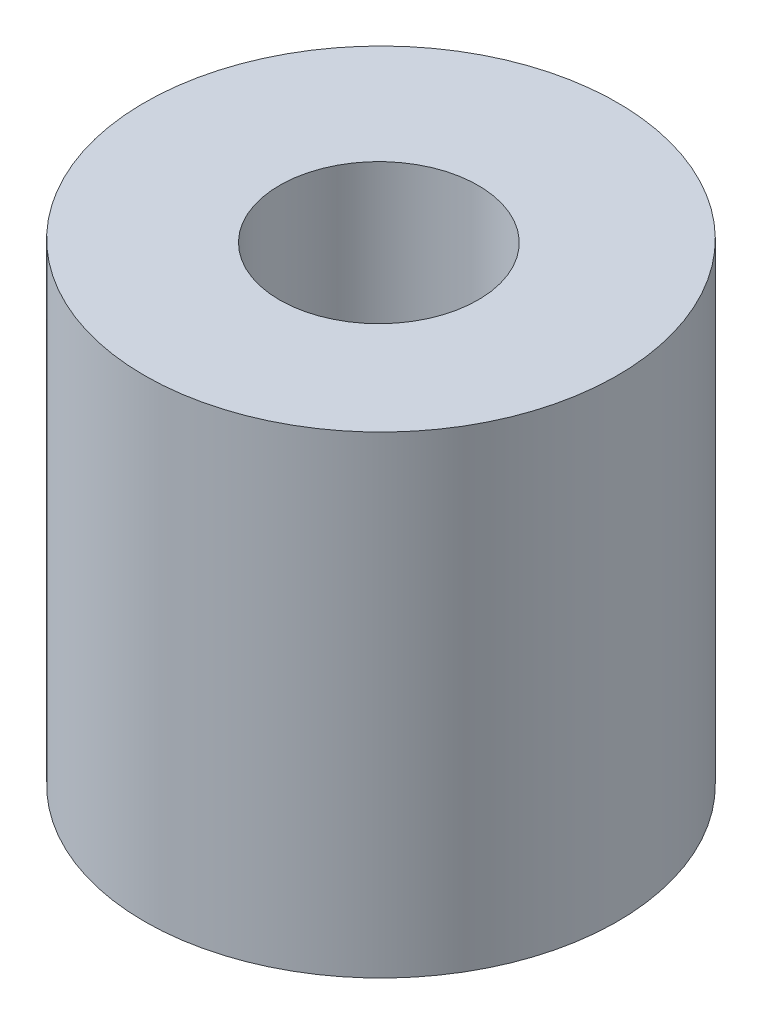
ISO-10303-21;
HEADER;
FILE_DESCRIPTION(('STEP AP214'),'2;1');
FILE_NAME('part.step','',(''),(''),'','','');
FILE_SCHEMA(('AUTOMOTIVE_DESIGN { 1 0 10303 214 1 1 1 1 }'));
ENDSEC;
DATA;
#1=APPLICATION_CONTEXT('core data for automotive mechanical design processes');
#2=APPLICATION_PROTOCOL_DEFINITION('international standard','automotive_design',2000,#1);
#3=PRODUCT_CONTEXT('',#1,'mechanical');
#4=PRODUCT('Part','Part','',(#3));
#5=PRODUCT_RELATED_PRODUCT_CATEGORY('part','',(#4));
#6=PRODUCT_DEFINITION_FORMATION('','',#4);
#7=PRODUCT_DEFINITION_CONTEXT('part definition',#1,'design');
#8=PRODUCT_DEFINITION('design','',#6,#7);
#9=PRODUCT_DEFINITION_SHAPE('','',#8);
#10=(LENGTH_UNIT() NAMED_UNIT(*) SI_UNIT(.MILLI.,.METRE.));
#11=(NAMED_UNIT(*) PLANE_ANGLE_UNIT() SI_UNIT($,.RADIAN.));
#12=(NAMED_UNIT(*) SI_UNIT($,.STERADIAN.) SOLID_ANGLE_UNIT());
#13=UNCERTAINTY_MEASURE_WITH_UNIT(LENGTH_MEASURE(1.E-05),#10,'distance_accuracy_value','');
#14=(GEOMETRIC_REPRESENTATION_CONTEXT(3) GLOBAL_UNCERTAINTY_ASSIGNED_CONTEXT((#13)) GLOBAL_UNIT_ASSIGNED_CONTEXT((#10,
#11,#12)) REPRESENTATION_CONTEXT('',''));
#15=CARTESIAN_POINT('',(0.,0.,0.));
#16=DIRECTION('',(0.,0.,1.));
#17=DIRECTION('',(1.,0.,0.));
#18=AXIS2_PLACEMENT_3D('',#15,#16,#17);
#19=CARTESIAN_POINT('',(0.,5.,-0.0331523851029615));
#20=DIRECTION('',(0.,1.,0.));
#21=DIRECTION('',(0.,0.,1.));
#22=AXIS2_PLACEMENT_3D('',#19,#20,#21);
#23=PLANE('',#22);
#24=CARTESIAN_POINT('',(0.,5.,-0.0331523851029615));
#25=DIRECTION('',(0.,1.,0.));
#26=DIRECTION('',(0.,0.,1.));
#27=AXIS2_PLACEMENT_3D('',#24,#25,#26);
#28=CIRCLE('',#27,2.5);
#29=CARTESIAN_POINT('',(0.,5.,2.46684761489704));
#30=VERTEX_POINT('',#29);
#31=EDGE_CURVE('E10',#30,#30,#28,.T.);
#32=ORIENTED_EDGE('',*,*,#31,.T.);
#33=EDGE_LOOP('',(#32));
#34=FACE_BOUND('',#33,.T.);
#35=CARTESIAN_POINT('',(0.022101590068641,5.,0.0110507950343205));
#36=DIRECTION('',(0.,1.,0.));
#37=DIRECTION('',(0.,0.,1.));
#38=AXIS2_PLACEMENT_3D('',#35,#36,#37);
#39=CIRCLE('',#38,1.05);
#40=CARTESIAN_POINT('',(0.022101590068641,5.,1.06105079503432));
#41=VERTEX_POINT('',#40);
#42=EDGE_CURVE('E50',#41,#41,#39,.T.);
#43=ORIENTED_EDGE('',*,*,#42,.F.);
#44=EDGE_LOOP('',(#43));
#45=FACE_BOUND('',#44,.T.);
#46=ADVANCED_FACE('F39',(#34,#45),#23,.T.);
#47=CARTESIAN_POINT('',(0.,0.,-0.0331523851029615));
#48=DIRECTION('',(0.,1.,0.));
#49=DIRECTION('',(0.,0.,1.));
#50=AXIS2_PLACEMENT_3D('',#47,#48,#49);
#51=PLANE('',#50);
#52=CARTESIAN_POINT('',(0.,0.,-0.0331523851029615));
#53=DIRECTION('',(0.,1.,0.));
#54=DIRECTION('',(0.,0.,1.));
#55=AXIS2_PLACEMENT_3D('',#52,#53,#54);
#56=CIRCLE('',#55,2.5);
#57=CARTESIAN_POINT('',(0.,0.,2.46684761489704));
#58=VERTEX_POINT('',#57);
#59=EDGE_CURVE('E43',#58,#58,#56,.T.);
#60=ORIENTED_EDGE('',*,*,#59,.F.);
#61=EDGE_LOOP('',(#60));
#62=FACE_BOUND('',#61,.T.);
#63=CARTESIAN_POINT('',(0.022101590068641,0.,0.0110507950343205));
#64=DIRECTION('',(0.,1.,0.));
#65=DIRECTION('',(0.,0.,1.));
#66=AXIS2_PLACEMENT_3D('',#63,#64,#65);
#67=CIRCLE('',#66,1.05);
#68=CARTESIAN_POINT('',(0.022101590068641,0.,1.06105079503432));
#69=VERTEX_POINT('',#68);
#70=EDGE_CURVE('E52',#69,#69,#67,.T.);
#71=ORIENTED_EDGE('',*,*,#70,.T.);
#72=EDGE_LOOP('',(#71));
#73=FACE_BOUND('',#72,.T.);
#74=ADVANCED_FACE('F62',(#62,#73),#51,.F.);
#75=CARTESIAN_POINT('',(0.,5.,-0.0331523851029615));
#76=DIRECTION('',(0.,-1.,0.));
#77=DIRECTION('',(0.,0.,-1.));
#78=AXIS2_PLACEMENT_3D('',#75,#76,#77);
#79=CYLINDRICAL_SURFACE('',#78,2.5);
#80=ORIENTED_EDGE('',*,*,#31,.F.);
#81=EDGE_LOOP('',(#80));
#82=FACE_BOUND('',#81,.T.);
#83=ORIENTED_EDGE('',*,*,#59,.T.);
#84=EDGE_LOOP('',(#83));
#85=FACE_BOUND('',#84,.T.);
#86=ADVANCED_FACE('F41',(#82,#85),#79,.T.);
#87=CARTESIAN_POINT('',(0.022101590068641,5.,0.0110507950343205));
#88=DIRECTION('',(0.,-1.,0.));
#89=DIRECTION('',(0.,0.,-1.));
#90=AXIS2_PLACEMENT_3D('',#87,#88,#89);
#91=CYLINDRICAL_SURFACE('',#90,1.05);
#92=ORIENTED_EDGE('',*,*,#42,.T.);
#93=EDGE_LOOP('',(#92));
#94=FACE_BOUND('',#93,.T.);
#95=ORIENTED_EDGE('',*,*,#70,.F.);
#96=EDGE_LOOP('',(#95));
#97=FACE_BOUND('',#96,.T.);
#98=ADVANCED_FACE('F58',(#94,#97),#91,.F.);
#99=CLOSED_SHELL('',(#46,#74,#86,#98));
#100=MANIFOLD_SOLID_BREP('B2',#99);
#101=ADVANCED_BREP_SHAPE_REPRESENTATION('',(#18,#100),#14);
#102=SHAPE_DEFINITION_REPRESENTATION(#9,#101);
ENDSEC;
END-ISO-10303-21;
